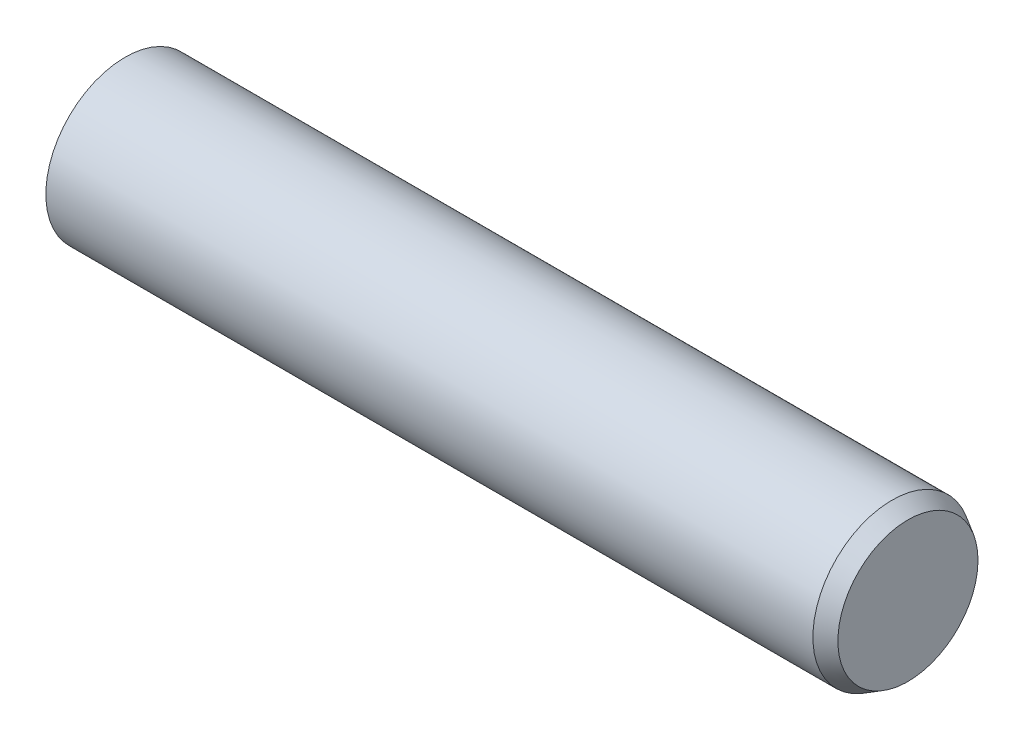
ISO-10303-21;
HEADER;
FILE_DESCRIPTION(('STEP AP214'),'2;1');
FILE_NAME('part.step','',(''),(''),'','','');
FILE_SCHEMA(('AUTOMOTIVE_DESIGN { 1 0 10303 214 1 1 1 1 }'));
ENDSEC;
DATA;
#1=APPLICATION_CONTEXT('core data for automotive mechanical design processes');
#2=APPLICATION_PROTOCOL_DEFINITION('international standard','automotive_design',2000,#1);
#3=PRODUCT_CONTEXT('',#1,'mechanical');
#4=PRODUCT('Part','Part','',(#3));
#5=PRODUCT_RELATED_PRODUCT_CATEGORY('part','',(#4));
#6=PRODUCT_DEFINITION_FORMATION('','',#4);
#7=PRODUCT_DEFINITION_CONTEXT('part definition',#1,'design');
#8=PRODUCT_DEFINITION('design','',#6,#7);
#9=PRODUCT_DEFINITION_SHAPE('','',#8);
#10=(LENGTH_UNIT() NAMED_UNIT(*) SI_UNIT(.MILLI.,.METRE.));
#11=(NAMED_UNIT(*) PLANE_ANGLE_UNIT() SI_UNIT($,.RADIAN.));
#12=(NAMED_UNIT(*) SI_UNIT($,.STERADIAN.) SOLID_ANGLE_UNIT());
#13=UNCERTAINTY_MEASURE_WITH_UNIT(LENGTH_MEASURE(1.E-05),#10,'distance_accuracy_value','');
#14=(GEOMETRIC_REPRESENTATION_CONTEXT(3) GLOBAL_UNCERTAINTY_ASSIGNED_CONTEXT((#13)) GLOBAL_UNIT_ASSIGNED_CONTEXT((#10,
#11,#12)) REPRESENTATION_CONTEXT('',''));
#15=CARTESIAN_POINT('',(0.,0.,0.));
#16=DIRECTION('',(0.,0.,1.));
#17=DIRECTION('',(1.,0.,0.));
#18=AXIS2_PLACEMENT_3D('',#15,#16,#17);
#19=CARTESIAN_POINT('',(50.,0.,0.));
#20=DIRECTION('',(-1.,0.,0.));
#21=DIRECTION('',(0.,0.,1.));
#22=AXIS2_PLACEMENT_3D('',#19,#20,#21);
#23=CYLINDRICAL_SURFACE('',#22,10.);
#24=CARTESIAN_POINT('',(-48.8452994616207,0.,0.));
#25=DIRECTION('',(1.,0.,0.));
#26=DIRECTION('',(0.,0.,-1.));
#27=AXIS2_PLACEMENT_3D('',#24,#25,#26);
#28=CIRCLE('',#27,10.);
#29=CARTESIAN_POINT('',(-48.8452994616207,0.,-10.));
#30=VERTEX_POINT('',#29);
#31=EDGE_CURVE('E44',#30,#30,#28,.T.);
#32=ORIENTED_EDGE('',*,*,#31,.T.);
#33=EDGE_LOOP('',(#32));
#34=FACE_BOUND('',#33,.T.);
#35=CARTESIAN_POINT('',(48.,0.,0.));
#36=DIRECTION('',(1.,0.,0.));
#37=DIRECTION('',(0.,0.,-1.));
#38=AXIS2_PLACEMENT_3D('',#35,#36,#37);
#39=CIRCLE('',#38,10.);
#40=CARTESIAN_POINT('',(48.,0.,-10.));
#41=VERTEX_POINT('',#40);
#42=EDGE_CURVE('E48',#41,#41,#39,.F.);
#43=ORIENTED_EDGE('',*,*,#42,.T.);
#44=EDGE_LOOP('',(#43));
#45=FACE_BOUND('',#44,.T.);
#46=ADVANCED_FACE('F33',(#34,#45),#23,.T.);
#47=CARTESIAN_POINT('',(50.,0.,0.));
#48=DIRECTION('',(1.,0.,0.));
#49=DIRECTION('',(0.,0.,-1.));
#50=AXIS2_PLACEMENT_3D('',#47,#48,#49);
#51=PLANE('',#50);
#52=CARTESIAN_POINT('',(50.,0.,0.));
#53=DIRECTION('',(1.,0.,0.));
#54=DIRECTION('',(0.,0.,-1.));
#55=AXIS2_PLACEMENT_3D('',#52,#53,#54);
#56=CIRCLE('',#55,8.84529946162074);
#57=CARTESIAN_POINT('',(50.,0.,-8.84529946162074));
#58=VERTEX_POINT('',#57);
#59=EDGE_CURVE('E10',#58,#58,#56,.T.);
#60=ORIENTED_EDGE('',*,*,#59,.T.);
#61=EDGE_LOOP('',(#60));
#62=FACE_BOUND('',#61,.T.);
#63=ADVANCED_FACE('F64',(#62),#51,.T.);
#64=CARTESIAN_POINT('',(-50.,0.,0.));
#65=DIRECTION('',(1.,0.,0.));
#66=DIRECTION('',(0.,0.,-1.));
#67=AXIS2_PLACEMENT_3D('',#64,#65,#66);
#68=PLANE('',#67);
#69=CARTESIAN_POINT('',(-50.,0.,0.));
#70=DIRECTION('',(1.,0.,0.));
#71=DIRECTION('',(0.,0.,-1.));
#72=AXIS2_PLACEMENT_3D('',#69,#70,#71);
#73=CIRCLE('',#72,7.99999999999999);
#74=CARTESIAN_POINT('',(-50.,0.,-7.99999999999999));
#75=VERTEX_POINT('',#74);
#76=EDGE_CURVE('E40',#75,#75,#73,.F.);
#77=ORIENTED_EDGE('',*,*,#76,.T.);
#78=EDGE_LOOP('',(#77));
#79=FACE_BOUND('',#78,.T.);
#80=ADVANCED_FACE('F61',(#79),#68,.F.);
#81=CARTESIAN_POINT('',(-48.8452994616207,0.,0.));
#82=DIRECTION('',(1.,0.,0.));
#83=DIRECTION('',(0.,0.,-1.));
#84=AXIS2_PLACEMENT_3D('',#81,#82,#83);
#85=CONICAL_SURFACE('',#84,10.,1.0471975511966);
#86=ORIENTED_EDGE('',*,*,#76,.F.);
#87=EDGE_LOOP('',(#86));
#88=FACE_BOUND('',#87,.T.);
#89=ORIENTED_EDGE('',*,*,#31,.F.);
#90=EDGE_LOOP('',(#89));
#91=FACE_BOUND('',#90,.T.);
#92=ADVANCED_FACE('F57',(#88,#91),#85,.T.);
#93=CARTESIAN_POINT('',(50.,0.,0.));
#94=DIRECTION('',(-1.,0.,0.));
#95=DIRECTION('',(0.,0.,1.));
#96=AXIS2_PLACEMENT_3D('',#93,#94,#95);
#97=CONICAL_SURFACE('',#96,8.84529946162074,0.523598775598295);
#98=ORIENTED_EDGE('',*,*,#42,.F.);
#99=EDGE_LOOP('',(#98));
#100=FACE_BOUND('',#99,.T.);
#101=ORIENTED_EDGE('',*,*,#59,.F.);
#102=EDGE_LOOP('',(#101));
#103=FACE_BOUND('',#102,.T.);
#104=ADVANCED_FACE('F35',(#100,#103),#97,.T.);
#105=CLOSED_SHELL('',(#46,#63,#80,#92,#104));
#106=MANIFOLD_SOLID_BREP('B2',#105);
#107=ADVANCED_BREP_SHAPE_REPRESENTATION('',(#18,#106),#14);
#108=SHAPE_DEFINITION_REPRESENTATION(#9,#107);
ENDSEC;
END-ISO-10303-21;
